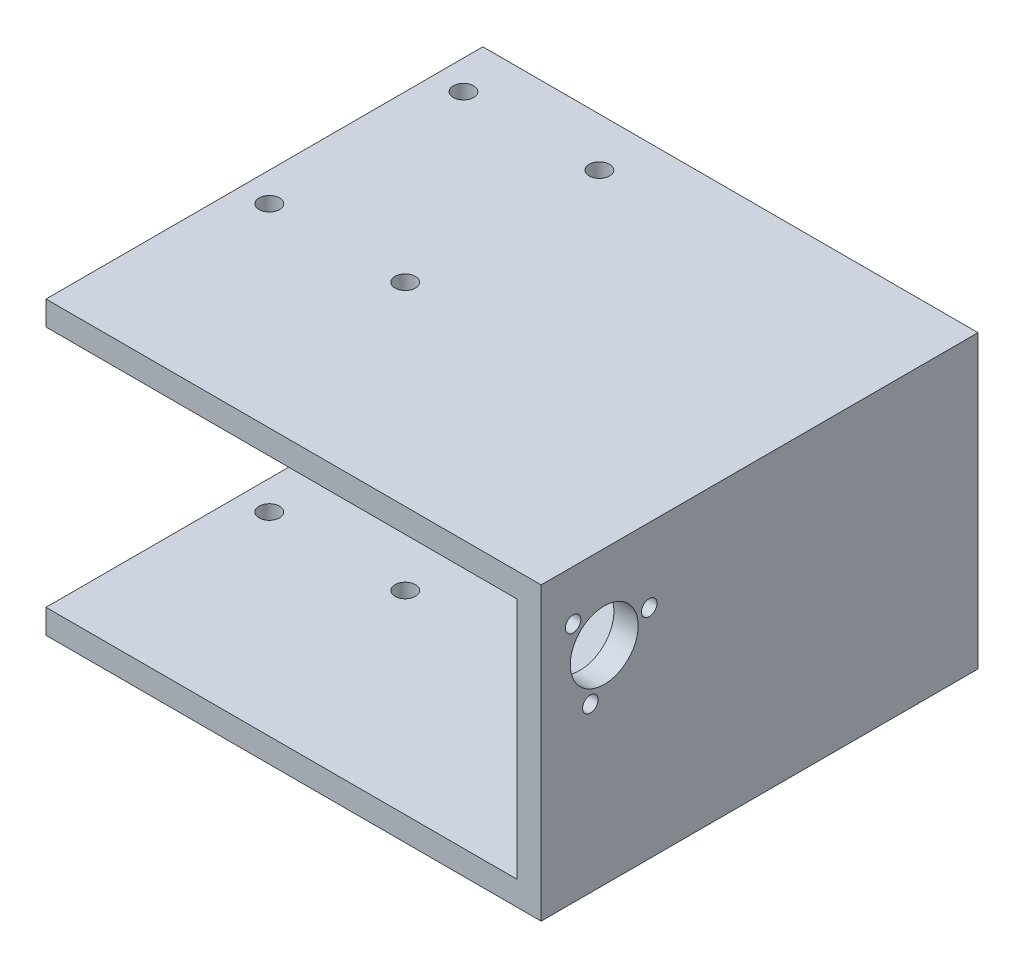
ISO-10303-21;
HEADER;
FILE_DESCRIPTION(('STEP AP214'),'2;1');
FILE_NAME('part.step','',(''),(''),'','','');
FILE_SCHEMA(('AUTOMOTIVE_DESIGN { 1 0 10303 214 1 1 1 1 }'));
ENDSEC;
DATA;
#1=APPLICATION_CONTEXT('core data for automotive mechanical design processes');
#2=APPLICATION_PROTOCOL_DEFINITION('international standard','automotive_design',2000,#1);
#3=PRODUCT_CONTEXT('',#1,'mechanical');
#4=PRODUCT('Part','Part','',(#3));
#5=PRODUCT_RELATED_PRODUCT_CATEGORY('part','',(#4));
#6=PRODUCT_DEFINITION_FORMATION('','',#4);
#7=PRODUCT_DEFINITION_CONTEXT('part definition',#1,'design');
#8=PRODUCT_DEFINITION('design','',#6,#7);
#9=PRODUCT_DEFINITION_SHAPE('','',#8);
#10=(LENGTH_UNIT() NAMED_UNIT(*) SI_UNIT(.MILLI.,.METRE.));
#11=(NAMED_UNIT(*) PLANE_ANGLE_UNIT() SI_UNIT($,.RADIAN.));
#12=(NAMED_UNIT(*) SI_UNIT($,.STERADIAN.) SOLID_ANGLE_UNIT());
#13=UNCERTAINTY_MEASURE_WITH_UNIT(LENGTH_MEASURE(1.E-05),#10,'distance_accuracy_value','');
#14=(GEOMETRIC_REPRESENTATION_CONTEXT(3) GLOBAL_UNCERTAINTY_ASSIGNED_CONTEXT((#13)) GLOBAL_UNIT_ASSIGNED_CONTEXT((#10,
#11,#12)) REPRESENTATION_CONTEXT('',''));
#15=CARTESIAN_POINT('',(0.,0.,0.));
#16=DIRECTION('',(0.,0.,1.));
#17=DIRECTION('',(1.,0.,0.));
#18=AXIS2_PLACEMENT_3D('',#15,#16,#17);
#19=CARTESIAN_POINT('',(0.,-55.,90.));
#20=DIRECTION('',(-1.,0.,0.));
#21=DIRECTION('',(0.,0.,1.));
#22=AXIS2_PLACEMENT_3D('',#19,#20,#21);
#23=PLANE('',#22);
#24=DIRECTION('',(0.,1.,0.));
#25=VECTOR('',#24,1.);
#26=CARTESIAN_POINT('',(0.,-55.,0.));
#27=LINE('',#26,#25);
#28=CARTESIAN_POINT('',(0.,-55.,0.));
#29=VERTEX_POINT('',#28);
#30=CARTESIAN_POINT('',(0.,-50.,0.));
#31=VERTEX_POINT('',#30);
#32=EDGE_CURVE('E139',#29,#31,#27,.T.);
#33=ORIENTED_EDGE('',*,*,#32,.F.);
#34=DIRECTION('',(0.,0.,-1.));
#35=VECTOR('',#34,1.);
#36=CARTESIAN_POINT('',(0.,-55.,90.));
#37=LINE('',#36,#35);
#38=CARTESIAN_POINT('',(0.,-55.,90.));
#39=VERTEX_POINT('',#38);
#40=EDGE_CURVE('E11',#39,#29,#37,.T.);
#41=ORIENTED_EDGE('',*,*,#40,.F.);
#42=DIRECTION('',(0.,1.,0.));
#43=VECTOR('',#42,1.);
#44=CARTESIAN_POINT('',(0.,-55.,90.));
#45=LINE('',#44,#43);
#46=CARTESIAN_POINT('',(0.,-50.,90.));
#47=VERTEX_POINT('',#46);
#48=EDGE_CURVE('E160',#39,#47,#45,.T.);
#49=ORIENTED_EDGE('',*,*,#48,.T.);
#50=DIRECTION('',(0.,0.,-1.));
#51=VECTOR('',#50,1.);
#52=CARTESIAN_POINT('',(0.,-50.,90.));
#53=LINE('',#52,#51);
#54=EDGE_CURVE('E97',#47,#31,#53,.T.);
#55=ORIENTED_EDGE('',*,*,#54,.T.);
#56=EDGE_LOOP('',(#33,#41,#49,#55));
#57=FACE_BOUND('',#56,.T.);
#58=ADVANCED_FACE('F41',(#57),#23,.T.);
#59=CARTESIAN_POINT('',(102.,-55.,90.));
#60=DIRECTION('',(0.,-1.,0.));
#61=DIRECTION('',(1.,0.,0.));
#62=AXIS2_PLACEMENT_3D('',#59,#60,#61);
#63=PLANE('',#62);
#64=CARTESIAN_POINT('',(6.,-55.,50.));
#65=DIRECTION('',(0.,1.,0.));
#66=DIRECTION('',(0.,0.,1.));
#67=AXIS2_PLACEMENT_3D('',#64,#65,#66);
#68=CIRCLE('',#67,2.1);
#69=CARTESIAN_POINT('',(6.,-55.,52.1));
#70=VERTEX_POINT('',#69);
#71=EDGE_CURVE('E271',#70,#70,#68,.T.);
#72=ORIENTED_EDGE('',*,*,#71,.T.);
#73=EDGE_LOOP('',(#72));
#74=FACE_BOUND('',#73,.T.);
#75=CARTESIAN_POINT('',(34.,-55.,50.));
#76=DIRECTION('',(0.,1.,0.));
#77=DIRECTION('',(0.,0.,1.));
#78=AXIS2_PLACEMENT_3D('',#75,#76,#77);
#79=CIRCLE('',#78,2.1);
#80=CARTESIAN_POINT('',(34.,-55.,52.1));
#81=VERTEX_POINT('',#80);
#82=EDGE_CURVE('E344',#81,#81,#79,.T.);
#83=ORIENTED_EDGE('',*,*,#82,.T.);
#84=EDGE_LOOP('',(#83));
#85=FACE_BOUND('',#84,.T.);
#86=CARTESIAN_POINT('',(34.,-55.,10.));
#87=DIRECTION('',(0.,1.,0.));
#88=DIRECTION('',(0.,0.,1.));
#89=AXIS2_PLACEMENT_3D('',#86,#87,#88);
#90=CIRCLE('',#89,2.1);
#91=CARTESIAN_POINT('',(34.,-55.,12.1));
#92=VERTEX_POINT('',#91);
#93=EDGE_CURVE('E263',#92,#92,#90,.T.);
#94=ORIENTED_EDGE('',*,*,#93,.T.);
#95=EDGE_LOOP('',(#94));
#96=FACE_BOUND('',#95,.T.);
#97=CARTESIAN_POINT('',(6.,-55.,10.));
#98=DIRECTION('',(0.,1.,0.));
#99=DIRECTION('',(0.,0.,1.));
#100=AXIS2_PLACEMENT_3D('',#97,#98,#99);
#101=CIRCLE('',#100,2.1);
#102=CARTESIAN_POINT('',(6.,-55.,12.1));
#103=VERTEX_POINT('',#102);
#104=EDGE_CURVE('E261',#103,#103,#101,.T.);
#105=ORIENTED_EDGE('',*,*,#104,.T.);
#106=EDGE_LOOP('',(#105));
#107=FACE_BOUND('',#106,.T.);
#108=DIRECTION('',(-1.,0.,0.));
#109=VECTOR('',#108,1.);
#110=CARTESIAN_POINT('',(102.,-55.,0.));
#111=LINE('',#110,#109);
#112=CARTESIAN_POINT('',(102.,-55.,0.));
#113=VERTEX_POINT('',#112);
#114=EDGE_CURVE('E158',#113,#29,#111,.T.);
#115=ORIENTED_EDGE('',*,*,#114,.F.);
#116=DIRECTION('',(0.,0.,-1.));
#117=VECTOR('',#116,1.);
#118=CARTESIAN_POINT('',(102.,-55.,90.));
#119=LINE('',#118,#117);
#120=CARTESIAN_POINT('',(102.,-55.,90.));
#121=VERTEX_POINT('',#120);
#122=EDGE_CURVE('E50',#121,#113,#119,.T.);
#123=ORIENTED_EDGE('',*,*,#122,.F.);
#124=DIRECTION('',(-1.,0.,0.));
#125=VECTOR('',#124,1.);
#126=CARTESIAN_POINT('',(102.,-55.,90.));
#127=LINE('',#126,#125);
#128=EDGE_CURVE('E129',#121,#39,#127,.T.);
#129=ORIENTED_EDGE('',*,*,#128,.T.);
#130=ORIENTED_EDGE('',*,*,#40,.T.);
#131=EDGE_LOOP('',(#115,#123,#129,#130));
#132=FACE_BOUND('',#131,.T.);
#133=ADVANCED_FACE('F214',(#74,#85,#96,#107,#132),#63,.T.);
#134=CARTESIAN_POINT('',(102.,5.,90.));
#135=DIRECTION('',(1.,0.,0.));
#136=DIRECTION('',(0.,1.,0.));
#137=AXIS2_PLACEMENT_3D('',#134,#135,#136);
#138=PLANE('',#137);
#139=CARTESIAN_POINT('',(102.,-21.3117545365653,79.8521228443574));
#140=DIRECTION('',(1.,0.,0.));
#141=DIRECTION('',(0.,0.866025403784436,0.500000000000004));
#142=AXIS2_PLACEMENT_3D('',#139,#140,#141);
#143=CIRCLE('',#142,1.60000000000001);
#144=CARTESIAN_POINT('',(102.,-19.9261138905102,80.6521228443574));
#145=VERTEX_POINT('',#144);
#146=EDGE_CURVE('E323',#145,#145,#143,.T.);
#147=ORIENTED_EDGE('',*,*,#146,.F.);
#148=EDGE_LOOP('',(#147));
#149=FACE_BOUND('',#148,.T.);
#150=CARTESIAN_POINT('',(102.,-10.1891335696448,67.7262289462969));
#151=DIRECTION('',(1.,0.,0.));
#152=DIRECTION('',(0.,-0.866025403784443,0.499999999999992));
#153=AXIS2_PLACEMENT_3D('',#150,#151,#152);
#154=CIRCLE('',#153,1.60000000000001);
#155=CARTESIAN_POINT('',(102.,-11.5747742156999,68.5262289462969));
#156=VERTEX_POINT('',#155);
#157=EDGE_CURVE('E328',#156,#156,#154,.T.);
#158=ORIENTED_EDGE('',*,*,#157,.F.);
#159=EDGE_LOOP('',(#158));
#160=FACE_BOUND('',#159,.T.);
#161=CARTESIAN_POINT('',(102.,-5.24911189378993,83.4216482093457));
#162=DIRECTION('',(1.,0.,0.));
#163=DIRECTION('',(0.,0.,-1.));
#164=AXIS2_PLACEMENT_3D('',#161,#162,#163);
#165=CIRCLE('',#164,1.60000000000001);
#166=CARTESIAN_POINT('',(102.,-5.24911189378993,81.8216482093457));
#167=VERTEX_POINT('',#166);
#168=EDGE_CURVE('E324',#167,#167,#165,.T.);
#169=ORIENTED_EDGE('',*,*,#168,.F.);
#170=EDGE_LOOP('',(#169));
#171=FACE_BOUND('',#170,.T.);
#172=CARTESIAN_POINT('',(102.,-12.25,77.));
#173=DIRECTION('',(1.,0.,0.));
#174=DIRECTION('',(0.,1.,0.));
#175=AXIS2_PLACEMENT_3D('',#172,#173,#174);
#176=CIRCLE('',#175,7.);
#177=CARTESIAN_POINT('',(102.,-5.25,77.));
#178=VERTEX_POINT('',#177);
#179=EDGE_CURVE('E339',#178,#178,#176,.T.);
#180=ORIENTED_EDGE('',*,*,#179,.F.);
#181=EDGE_LOOP('',(#180));
#182=FACE_BOUND('',#181,.T.);
#183=DIRECTION('',(0.,-1.,0.));
#184=VECTOR('',#183,1.);
#185=CARTESIAN_POINT('',(102.,5.,0.));
#186=LINE('',#185,#184);
#187=CARTESIAN_POINT('',(102.,5.,0.));
#188=VERTEX_POINT('',#187);
#189=EDGE_CURVE('E116',#188,#113,#186,.T.);
#190=ORIENTED_EDGE('',*,*,#189,.F.);
#191=DIRECTION('',(0.,0.,-1.));
#192=VECTOR('',#191,1.);
#193=CARTESIAN_POINT('',(102.,5.,90.));
#194=LINE('',#193,#192);
#195=CARTESIAN_POINT('',(102.,5.,90.));
#196=VERTEX_POINT('',#195);
#197=EDGE_CURVE('E111',#196,#188,#194,.T.);
#198=ORIENTED_EDGE('',*,*,#197,.F.);
#199=DIRECTION('',(0.,-1.,0.));
#200=VECTOR('',#199,1.);
#201=CARTESIAN_POINT('',(102.,5.,90.));
#202=LINE('',#201,#200);
#203=EDGE_CURVE('E114',#196,#121,#202,.T.);
#204=ORIENTED_EDGE('',*,*,#203,.T.);
#205=ORIENTED_EDGE('',*,*,#122,.T.);
#206=EDGE_LOOP('',(#190,#198,#204,#205));
#207=FACE_BOUND('',#206,.T.);
#208=ADVANCED_FACE('F113',(#149,#160,#171,#182,#207),#138,.T.);
#209=CARTESIAN_POINT('',(0.,5.,90.));
#210=DIRECTION('',(0.,1.,0.));
#211=DIRECTION('',(0.,0.,1.));
#212=AXIS2_PLACEMENT_3D('',#209,#210,#211);
#213=PLANE('',#212);
#214=CARTESIAN_POINT('',(6.,5.,50.));
#215=DIRECTION('',(0.,1.,0.));
#216=DIRECTION('',(0.,0.,1.));
#217=AXIS2_PLACEMENT_3D('',#214,#215,#216);
#218=CIRCLE('',#217,2.1);
#219=CARTESIAN_POINT('',(6.,5.,52.1));
#220=VERTEX_POINT('',#219);
#221=EDGE_CURVE('E342',#220,#220,#218,.T.);
#222=ORIENTED_EDGE('',*,*,#221,.F.);
#223=EDGE_LOOP('',(#222));
#224=FACE_BOUND('',#223,.T.);
#225=CARTESIAN_POINT('',(34.,5.,50.));
#226=DIRECTION('',(0.,1.,0.));
#227=DIRECTION('',(0.,0.,1.));
#228=AXIS2_PLACEMENT_3D('',#225,#226,#227);
#229=CIRCLE('',#228,2.1);
#230=CARTESIAN_POINT('',(34.,5.,52.1));
#231=VERTEX_POINT('',#230);
#232=EDGE_CURVE('E346',#231,#231,#229,.T.);
#233=ORIENTED_EDGE('',*,*,#232,.F.);
#234=EDGE_LOOP('',(#233));
#235=FACE_BOUND('',#234,.T.);
#236=CARTESIAN_POINT('',(34.,5.,10.));
#237=DIRECTION('',(0.,1.,0.));
#238=DIRECTION('',(0.,0.,1.));
#239=AXIS2_PLACEMENT_3D('',#236,#237,#238);
#240=CIRCLE('',#239,2.1);
#241=CARTESIAN_POINT('',(34.,5.,12.1));
#242=VERTEX_POINT('',#241);
#243=EDGE_CURVE('E268',#242,#242,#240,.T.);
#244=ORIENTED_EDGE('',*,*,#243,.F.);
#245=EDGE_LOOP('',(#244));
#246=FACE_BOUND('',#245,.T.);
#247=CARTESIAN_POINT('',(6.,5.,10.));
#248=DIRECTION('',(0.,1.,0.));
#249=DIRECTION('',(0.,0.,1.));
#250=AXIS2_PLACEMENT_3D('',#247,#248,#249);
#251=CIRCLE('',#250,2.1);
#252=CARTESIAN_POINT('',(6.,5.,12.1));
#253=VERTEX_POINT('',#252);
#254=EDGE_CURVE('E175',#253,#253,#251,.T.);
#255=ORIENTED_EDGE('',*,*,#254,.F.);
#256=EDGE_LOOP('',(#255));
#257=FACE_BOUND('',#256,.T.);
#258=DIRECTION('',(1.,0.,0.));
#259=VECTOR('',#258,1.);
#260=CARTESIAN_POINT('',(0.,5.,0.));
#261=LINE('',#260,#259);
#262=CARTESIAN_POINT('',(0.,5.,0.));
#263=VERTEX_POINT('',#262);
#264=EDGE_CURVE('E155',#263,#188,#261,.T.);
#265=ORIENTED_EDGE('',*,*,#264,.F.);
#266=DIRECTION('',(0.,0.,-1.));
#267=VECTOR('',#266,1.);
#268=CARTESIAN_POINT('',(0.,5.,90.));
#269=LINE('',#268,#267);
#270=CARTESIAN_POINT('',(0.,5.,90.));
#271=VERTEX_POINT('',#270);
#272=EDGE_CURVE('E121',#271,#263,#269,.T.);
#273=ORIENTED_EDGE('',*,*,#272,.F.);
#274=DIRECTION('',(1.,0.,0.));
#275=VECTOR('',#274,1.);
#276=CARTESIAN_POINT('',(0.,5.,90.));
#277=LINE('',#276,#275);
#278=EDGE_CURVE('E127',#271,#196,#277,.T.);
#279=ORIENTED_EDGE('',*,*,#278,.T.);
#280=ORIENTED_EDGE('',*,*,#197,.T.);
#281=EDGE_LOOP('',(#265,#273,#279,#280));
#282=FACE_BOUND('',#281,.T.);
#283=ADVANCED_FACE('F131',(#224,#235,#246,#257,#282),#213,.T.);
#284=CARTESIAN_POINT('',(0.,0.,90.));
#285=DIRECTION('',(-1.,0.,0.));
#286=DIRECTION('',(0.,0.,1.));
#287=AXIS2_PLACEMENT_3D('',#284,#285,#286);
#288=PLANE('',#287);
#289=DIRECTION('',(0.,1.,0.));
#290=VECTOR('',#289,1.);
#291=CARTESIAN_POINT('',(0.,0.,0.));
#292=LINE('',#291,#290);
#293=CARTESIAN_POINT('',(0.,0.,0.));
#294=VERTEX_POINT('',#293);
#295=EDGE_CURVE('E152',#294,#263,#292,.T.);
#296=ORIENTED_EDGE('',*,*,#295,.F.);
#297=DIRECTION('',(0.,0.,-1.));
#298=VECTOR('',#297,1.);
#299=CARTESIAN_POINT('',(0.,0.,90.));
#300=LINE('',#299,#298);
#301=CARTESIAN_POINT('',(0.,0.,90.));
#302=VERTEX_POINT('',#301);
#303=EDGE_CURVE('E164',#302,#294,#300,.T.);
#304=ORIENTED_EDGE('',*,*,#303,.F.);
#305=DIRECTION('',(0.,1.,0.));
#306=VECTOR('',#305,1.);
#307=CARTESIAN_POINT('',(0.,0.,90.));
#308=LINE('',#307,#306);
#309=EDGE_CURVE('E132',#302,#271,#308,.T.);
#310=ORIENTED_EDGE('',*,*,#309,.T.);
#311=ORIENTED_EDGE('',*,*,#272,.T.);
#312=EDGE_LOOP('',(#296,#304,#310,#311));
#313=FACE_BOUND('',#312,.T.);
#314=ADVANCED_FACE('F232',(#313),#288,.T.);
#315=CARTESIAN_POINT('',(97.,0.,90.));
#316=DIRECTION('',(0.,-1.,0.));
#317=DIRECTION('',(1.,0.,0.));
#318=AXIS2_PLACEMENT_3D('',#315,#316,#317);
#319=PLANE('',#318);
#320=CARTESIAN_POINT('',(6.,0.,50.));
#321=DIRECTION('',(0.,-1.,0.));
#322=DIRECTION('',(1.,0.,0.));
#323=AXIS2_PLACEMENT_3D('',#320,#321,#322);
#324=CIRCLE('',#323,2.1);
#325=CARTESIAN_POINT('',(8.1,0.,50.));
#326=VERTEX_POINT('',#325);
#327=EDGE_CURVE('E143',#326,#326,#324,.F.);
#328=ORIENTED_EDGE('',*,*,#327,.T.);
#329=EDGE_LOOP('',(#328));
#330=FACE_BOUND('',#329,.T.);
#331=CARTESIAN_POINT('',(34.,0.,50.));
#332=DIRECTION('',(0.,-1.,0.));
#333=DIRECTION('',(1.,0.,0.));
#334=AXIS2_PLACEMENT_3D('',#331,#332,#333);
#335=CIRCLE('',#334,2.1);
#336=CARTESIAN_POINT('',(36.1,0.,50.));
#337=VERTEX_POINT('',#336);
#338=EDGE_CURVE('E182',#337,#337,#335,.F.);
#339=ORIENTED_EDGE('',*,*,#338,.T.);
#340=EDGE_LOOP('',(#339));
#341=FACE_BOUND('',#340,.T.);
#342=CARTESIAN_POINT('',(34.,0.,10.));
#343=DIRECTION('',(0.,-1.,0.));
#344=DIRECTION('',(1.,0.,0.));
#345=AXIS2_PLACEMENT_3D('',#342,#343,#344);
#346=CIRCLE('',#345,2.1);
#347=CARTESIAN_POINT('',(36.1,0.,10.));
#348=VERTEX_POINT('',#347);
#349=EDGE_CURVE('E179',#348,#348,#346,.F.);
#350=ORIENTED_EDGE('',*,*,#349,.T.);
#351=EDGE_LOOP('',(#350));
#352=FACE_BOUND('',#351,.T.);
#353=CARTESIAN_POINT('',(6.,0.,10.));
#354=DIRECTION('',(0.,-1.,0.));
#355=DIRECTION('',(1.,0.,0.));
#356=AXIS2_PLACEMENT_3D('',#353,#354,#355);
#357=CIRCLE('',#356,2.1);
#358=CARTESIAN_POINT('',(8.1,0.,10.));
#359=VERTEX_POINT('',#358);
#360=EDGE_CURVE('E174',#359,#359,#357,.F.);
#361=ORIENTED_EDGE('',*,*,#360,.T.);
#362=EDGE_LOOP('',(#361));
#363=FACE_BOUND('',#362,.T.);
#364=DIRECTION('',(-1.,0.,0.));
#365=VECTOR('',#364,1.);
#366=CARTESIAN_POINT('',(97.,0.,0.));
#367=LINE('',#366,#365);
#368=CARTESIAN_POINT('',(97.,0.,0.));
#369=VERTEX_POINT('',#368);
#370=EDGE_CURVE('E149',#369,#294,#367,.T.);
#371=ORIENTED_EDGE('',*,*,#370,.F.);
#372=DIRECTION('',(0.,0.,-1.));
#373=VECTOR('',#372,1.);
#374=CARTESIAN_POINT('',(97.,0.,90.));
#375=LINE('',#374,#373);
#376=CARTESIAN_POINT('',(97.,0.,90.));
#377=VERTEX_POINT('',#376);
#378=EDGE_CURVE('E166',#377,#369,#375,.T.);
#379=ORIENTED_EDGE('',*,*,#378,.F.);
#380=DIRECTION('',(-1.,0.,0.));
#381=VECTOR('',#380,1.);
#382=CARTESIAN_POINT('',(97.,0.,90.));
#383=LINE('',#382,#381);
#384=EDGE_CURVE('E134',#377,#302,#383,.T.);
#385=ORIENTED_EDGE('',*,*,#384,.T.);
#386=ORIENTED_EDGE('',*,*,#303,.T.);
#387=EDGE_LOOP('',(#371,#379,#385,#386));
#388=FACE_BOUND('',#387,.T.);
#389=ADVANCED_FACE('F205',(#330,#341,#352,#363,#388),#319,.T.);
#390=CARTESIAN_POINT('',(97.,-50.,90.));
#391=DIRECTION('',(-1.,0.,0.));
#392=DIRECTION('',(0.,0.,1.));
#393=AXIS2_PLACEMENT_3D('',#390,#391,#392);
#394=PLANE('',#393);
#395=CARTESIAN_POINT('',(97.,-21.3117545365653,79.8521228443574));
#396=DIRECTION('',(-1.,0.,0.));
#397=DIRECTION('',(0.,-0.866025403784436,-0.500000000000004));
#398=AXIS2_PLACEMENT_3D('',#395,#396,#397);
#399=CIRCLE('',#398,1.60000000000001);
#400=CARTESIAN_POINT('',(97.,-22.6973951826204,79.0521228443574));
#401=VERTEX_POINT('',#400);
#402=EDGE_CURVE('E320',#401,#401,#399,.T.);
#403=ORIENTED_EDGE('',*,*,#402,.F.);
#404=EDGE_LOOP('',(#403));
#405=FACE_BOUND('',#404,.T.);
#406=CARTESIAN_POINT('',(97.,-10.1891335696448,67.7262289462969));
#407=DIRECTION('',(-1.,0.,0.));
#408=DIRECTION('',(0.,0.866025403784443,-0.499999999999992));
#409=AXIS2_PLACEMENT_3D('',#406,#407,#408);
#410=CIRCLE('',#409,1.60000000000001);
#411=CARTESIAN_POINT('',(97.,-8.80349292358964,66.9262289462969));
#412=VERTEX_POINT('',#411);
#413=EDGE_CURVE('E331',#412,#412,#410,.T.);
#414=ORIENTED_EDGE('',*,*,#413,.F.);
#415=EDGE_LOOP('',(#414));
#416=FACE_BOUND('',#415,.T.);
#417=CARTESIAN_POINT('',(97.,-5.24911189378993,83.4216482093457));
#418=DIRECTION('',(-1.,0.,0.));
#419=DIRECTION('',(0.,0.,1.));
#420=AXIS2_PLACEMENT_3D('',#417,#418,#419);
#421=CIRCLE('',#420,1.60000000000001);
#422=CARTESIAN_POINT('',(97.,-5.24911189378993,85.0216482093457));
#423=VERTEX_POINT('',#422);
#424=EDGE_CURVE('E44',#423,#423,#421,.T.);
#425=ORIENTED_EDGE('',*,*,#424,.F.);
#426=EDGE_LOOP('',(#425));
#427=FACE_BOUND('',#426,.T.);
#428=CARTESIAN_POINT('',(97.,-12.25,77.));
#429=DIRECTION('',(-1.,0.,0.));
#430=DIRECTION('',(0.,0.,1.));
#431=AXIS2_PLACEMENT_3D('',#428,#429,#430);
#432=CIRCLE('',#431,7.);
#433=CARTESIAN_POINT('',(97.,-12.25,84.));
#434=VERTEX_POINT('',#433);
#435=EDGE_CURVE('E336',#434,#434,#432,.T.);
#436=ORIENTED_EDGE('',*,*,#435,.F.);
#437=EDGE_LOOP('',(#436));
#438=FACE_BOUND('',#437,.T.);
#439=DIRECTION('',(0.,1.,0.));
#440=VECTOR('',#439,1.);
#441=CARTESIAN_POINT('',(97.,-50.,0.));
#442=LINE('',#441,#440);
#443=CARTESIAN_POINT('',(97.,-50.,0.));
#444=VERTEX_POINT('',#443);
#445=EDGE_CURVE('E146',#444,#369,#442,.T.);
#446=ORIENTED_EDGE('',*,*,#445,.F.);
#447=DIRECTION('',(0.,0.,-1.));
#448=VECTOR('',#447,1.);
#449=CARTESIAN_POINT('',(97.,-50.,90.));
#450=LINE('',#449,#448);
#451=CARTESIAN_POINT('',(97.,-50.,90.));
#452=VERTEX_POINT('',#451);
#453=EDGE_CURVE('E168',#452,#444,#450,.T.);
#454=ORIENTED_EDGE('',*,*,#453,.F.);
#455=DIRECTION('',(0.,1.,0.));
#456=VECTOR('',#455,1.);
#457=CARTESIAN_POINT('',(97.,-50.,90.));
#458=LINE('',#457,#456);
#459=EDGE_CURVE('E199',#452,#377,#458,.T.);
#460=ORIENTED_EDGE('',*,*,#459,.T.);
#461=ORIENTED_EDGE('',*,*,#378,.T.);
#462=EDGE_LOOP('',(#446,#454,#460,#461));
#463=FACE_BOUND('',#462,.T.);
#464=ADVANCED_FACE('F210',(#405,#416,#427,#438,#463),#394,.T.);
#465=CARTESIAN_POINT('',(0.,-50.,90.));
#466=DIRECTION('',(0.,1.,0.));
#467=DIRECTION('',(0.,0.,1.));
#468=AXIS2_PLACEMENT_3D('',#465,#466,#467);
#469=PLANE('',#468);
#470=CARTESIAN_POINT('',(6.,-50.,50.));
#471=DIRECTION('',(0.,1.,0.));
#472=DIRECTION('',(0.,0.,1.));
#473=AXIS2_PLACEMENT_3D('',#470,#471,#472);
#474=CIRCLE('',#473,2.1);
#475=CARTESIAN_POINT('',(6.,-50.,52.1));
#476=VERTEX_POINT('',#475);
#477=EDGE_CURVE('E183',#476,#476,#474,.F.);
#478=ORIENTED_EDGE('',*,*,#477,.T.);
#479=EDGE_LOOP('',(#478));
#480=FACE_BOUND('',#479,.T.);
#481=CARTESIAN_POINT('',(34.,-50.,50.));
#482=DIRECTION('',(0.,1.,0.));
#483=DIRECTION('',(0.,0.,1.));
#484=AXIS2_PLACEMENT_3D('',#481,#482,#483);
#485=CIRCLE('',#484,2.1);
#486=CARTESIAN_POINT('',(34.,-50.,52.1));
#487=VERTEX_POINT('',#486);
#488=EDGE_CURVE('E180',#487,#487,#485,.F.);
#489=ORIENTED_EDGE('',*,*,#488,.T.);
#490=EDGE_LOOP('',(#489));
#491=FACE_BOUND('',#490,.T.);
#492=CARTESIAN_POINT('',(34.,-50.,10.));
#493=DIRECTION('',(0.,1.,0.));
#494=DIRECTION('',(0.,0.,1.));
#495=AXIS2_PLACEMENT_3D('',#492,#493,#494);
#496=CIRCLE('',#495,2.1);
#497=CARTESIAN_POINT('',(34.,-50.,12.1));
#498=VERTEX_POINT('',#497);
#499=EDGE_CURVE('E176',#498,#498,#496,.F.);
#500=ORIENTED_EDGE('',*,*,#499,.T.);
#501=EDGE_LOOP('',(#500));
#502=FACE_BOUND('',#501,.T.);
#503=CARTESIAN_POINT('',(6.,-50.,10.));
#504=DIRECTION('',(0.,1.,0.));
#505=DIRECTION('',(0.,0.,1.));
#506=AXIS2_PLACEMENT_3D('',#503,#504,#505);
#507=CIRCLE('',#506,2.1);
#508=CARTESIAN_POINT('',(6.,-50.,12.1));
#509=VERTEX_POINT('',#508);
#510=EDGE_CURVE('E171',#509,#509,#507,.F.);
#511=ORIENTED_EDGE('',*,*,#510,.T.);
#512=EDGE_LOOP('',(#511));
#513=FACE_BOUND('',#512,.T.);
#514=DIRECTION('',(1.,0.,0.));
#515=VECTOR('',#514,1.);
#516=CARTESIAN_POINT('',(0.,-50.,0.));
#517=LINE('',#516,#515);
#518=EDGE_CURVE('E142',#31,#444,#517,.T.);
#519=ORIENTED_EDGE('',*,*,#518,.F.);
#520=ORIENTED_EDGE('',*,*,#54,.F.);
#521=DIRECTION('',(1.,0.,0.));
#522=VECTOR('',#521,1.);
#523=CARTESIAN_POINT('',(0.,-50.,90.));
#524=LINE('',#523,#522);
#525=EDGE_CURVE('E197',#47,#452,#524,.T.);
#526=ORIENTED_EDGE('',*,*,#525,.T.);
#527=ORIENTED_EDGE('',*,*,#453,.T.);
#528=EDGE_LOOP('',(#519,#520,#526,#527));
#529=FACE_BOUND('',#528,.T.);
#530=ADVANCED_FACE('F211',(#480,#491,#502,#513,#529),#469,.T.);
#531=CARTESIAN_POINT('',(0.,0.,90.));
#532=DIRECTION('',(0.,0.,-1.));
#533=DIRECTION('',(-1.,0.,0.));
#534=AXIS2_PLACEMENT_3D('',#531,#532,#533);
#535=PLANE('',#534);
#536=ORIENTED_EDGE('',*,*,#48,.F.);
#537=ORIENTED_EDGE('',*,*,#128,.F.);
#538=ORIENTED_EDGE('',*,*,#203,.F.);
#539=ORIENTED_EDGE('',*,*,#278,.F.);
#540=ORIENTED_EDGE('',*,*,#309,.F.);
#541=ORIENTED_EDGE('',*,*,#384,.F.);
#542=ORIENTED_EDGE('',*,*,#459,.F.);
#543=ORIENTED_EDGE('',*,*,#525,.F.);
#544=EDGE_LOOP('',(#536,#537,#538,#539,#540,#541,#542,#543));
#545=FACE_BOUND('',#544,.T.);
#546=ADVANCED_FACE('F125',(#545),#535,.F.);
#547=CARTESIAN_POINT('',(0.,0.,0.));
#548=DIRECTION('',(0.,0.,-1.));
#549=DIRECTION('',(-1.,0.,0.));
#550=AXIS2_PLACEMENT_3D('',#547,#548,#549);
#551=PLANE('',#550);
#552=ORIENTED_EDGE('',*,*,#32,.T.);
#553=ORIENTED_EDGE('',*,*,#518,.T.);
#554=ORIENTED_EDGE('',*,*,#445,.T.);
#555=ORIENTED_EDGE('',*,*,#370,.T.);
#556=ORIENTED_EDGE('',*,*,#295,.T.);
#557=ORIENTED_EDGE('',*,*,#264,.T.);
#558=ORIENTED_EDGE('',*,*,#189,.T.);
#559=ORIENTED_EDGE('',*,*,#114,.T.);
#560=EDGE_LOOP('',(#552,#553,#554,#555,#556,#557,#558,#559));
#561=FACE_BOUND('',#560,.T.);
#562=ADVANCED_FACE('F213',(#561),#551,.T.);
#563=CARTESIAN_POINT('',(6.,5.,10.));
#564=DIRECTION('',(0.,-1.,0.));
#565=DIRECTION('',(0.,0.,-1.));
#566=AXIS2_PLACEMENT_3D('',#563,#564,#565);
#567=CYLINDRICAL_SURFACE('',#566,2.1);
#568=ORIENTED_EDGE('',*,*,#510,.F.);
#569=EDGE_LOOP('',(#568));
#570=FACE_BOUND('',#569,.T.);
#571=ORIENTED_EDGE('',*,*,#104,.F.);
#572=EDGE_LOOP('',(#571));
#573=FACE_BOUND('',#572,.T.);
#574=ADVANCED_FACE('F254',(#570,#573),#567,.F.);
#575=CARTESIAN_POINT('',(34.,5.,10.));
#576=DIRECTION('',(0.,-1.,0.));
#577=DIRECTION('',(0.,0.,-1.));
#578=AXIS2_PLACEMENT_3D('',#575,#576,#577);
#579=CYLINDRICAL_SURFACE('',#578,2.1);
#580=ORIENTED_EDGE('',*,*,#499,.F.);
#581=EDGE_LOOP('',(#580));
#582=FACE_BOUND('',#581,.T.);
#583=ORIENTED_EDGE('',*,*,#93,.F.);
#584=EDGE_LOOP('',(#583));
#585=FACE_BOUND('',#584,.T.);
#586=ADVANCED_FACE('F256',(#582,#585),#579,.F.);
#587=CARTESIAN_POINT('',(34.,5.,50.));
#588=DIRECTION('',(0.,-1.,0.));
#589=DIRECTION('',(0.,0.,-1.));
#590=AXIS2_PLACEMENT_3D('',#587,#588,#589);
#591=CYLINDRICAL_SURFACE('',#590,2.1);
#592=ORIENTED_EDGE('',*,*,#488,.F.);
#593=EDGE_LOOP('',(#592));
#594=FACE_BOUND('',#593,.T.);
#595=ORIENTED_EDGE('',*,*,#82,.F.);
#596=EDGE_LOOP('',(#595));
#597=FACE_BOUND('',#596,.T.);
#598=ADVANCED_FACE('F290',(#594,#597),#591,.F.);
#599=CARTESIAN_POINT('',(6.,5.,50.));
#600=DIRECTION('',(0.,-1.,0.));
#601=DIRECTION('',(0.,0.,-1.));
#602=AXIS2_PLACEMENT_3D('',#599,#600,#601);
#603=CYLINDRICAL_SURFACE('',#602,2.1);
#604=ORIENTED_EDGE('',*,*,#477,.F.);
#605=EDGE_LOOP('',(#604));
#606=FACE_BOUND('',#605,.T.);
#607=ORIENTED_EDGE('',*,*,#71,.F.);
#608=EDGE_LOOP('',(#607));
#609=FACE_BOUND('',#608,.T.);
#610=ADVANCED_FACE('F280',(#606,#609),#603,.F.);
#611=ORIENTED_EDGE('',*,*,#360,.F.);
#612=EDGE_LOOP('',(#611));
#613=FACE_BOUND('',#612,.T.);
#614=ORIENTED_EDGE('',*,*,#254,.T.);
#615=EDGE_LOOP('',(#614));
#616=FACE_BOUND('',#615,.T.);
#617=ADVANCED_FACE('F258',(#613,#616),#567,.F.);
#618=ORIENTED_EDGE('',*,*,#349,.F.);
#619=EDGE_LOOP('',(#618));
#620=FACE_BOUND('',#619,.T.);
#621=ORIENTED_EDGE('',*,*,#243,.T.);
#622=EDGE_LOOP('',(#621));
#623=FACE_BOUND('',#622,.T.);
#624=ADVANCED_FACE('F279',(#620,#623),#579,.F.);
#625=ORIENTED_EDGE('',*,*,#338,.F.);
#626=EDGE_LOOP('',(#625));
#627=FACE_BOUND('',#626,.T.);
#628=ORIENTED_EDGE('',*,*,#232,.T.);
#629=EDGE_LOOP('',(#628));
#630=FACE_BOUND('',#629,.T.);
#631=ADVANCED_FACE('F287',(#627,#630),#591,.F.);
#632=ORIENTED_EDGE('',*,*,#327,.F.);
#633=EDGE_LOOP('',(#632));
#634=FACE_BOUND('',#633,.T.);
#635=ORIENTED_EDGE('',*,*,#221,.T.);
#636=EDGE_LOOP('',(#635));
#637=FACE_BOUND('',#636,.T.);
#638=ADVANCED_FACE('F293',(#634,#637),#603,.F.);
#639=CARTESIAN_POINT('',(107.,-12.25,77.));
#640=DIRECTION('',(-1.,0.,0.));
#641=DIRECTION('',(0.,0.,1.));
#642=AXIS2_PLACEMENT_3D('',#639,#640,#641);
#643=CYLINDRICAL_SURFACE('',#642,7.);
#644=ORIENTED_EDGE('',*,*,#179,.T.);
#645=EDGE_LOOP('',(#644));
#646=FACE_BOUND('',#645,.T.);
#647=ORIENTED_EDGE('',*,*,#435,.T.);
#648=EDGE_LOOP('',(#647));
#649=FACE_BOUND('',#648,.T.);
#650=ADVANCED_FACE('F300',(#646,#649),#643,.F.);
#651=CARTESIAN_POINT('',(92.,-5.24911189378993,83.4216482093457));
#652=DIRECTION('',(1.,0.,0.));
#653=DIRECTION('',(0.,0.,-1.));
#654=AXIS2_PLACEMENT_3D('',#651,#652,#653);
#655=CYLINDRICAL_SURFACE('',#654,1.60000000000001);
#656=ORIENTED_EDGE('',*,*,#424,.T.);
#657=EDGE_LOOP('',(#656));
#658=FACE_BOUND('',#657,.T.);
#659=ORIENTED_EDGE('',*,*,#168,.T.);
#660=EDGE_LOOP('',(#659));
#661=FACE_BOUND('',#660,.T.);
#662=ADVANCED_FACE('F303',(#658,#661),#655,.F.);
#663=CARTESIAN_POINT('',(92.,-10.1891335696448,67.7262289462969));
#664=DIRECTION('',(1.,0.,0.));
#665=DIRECTION('',(0.,-0.866025403784443,0.499999999999992));
#666=AXIS2_PLACEMENT_3D('',#663,#664,#665);
#667=CYLINDRICAL_SURFACE('',#666,1.60000000000001);
#668=ORIENTED_EDGE('',*,*,#413,.T.);
#669=EDGE_LOOP('',(#668));
#670=FACE_BOUND('',#669,.T.);
#671=ORIENTED_EDGE('',*,*,#157,.T.);
#672=EDGE_LOOP('',(#671));
#673=FACE_BOUND('',#672,.T.);
#674=ADVANCED_FACE('F307',(#670,#673),#667,.F.);
#675=CARTESIAN_POINT('',(92.,-21.3117545365653,79.8521228443574));
#676=DIRECTION('',(1.,0.,0.));
#677=DIRECTION('',(0.,0.866025403784436,0.500000000000004));
#678=AXIS2_PLACEMENT_3D('',#675,#676,#677);
#679=CYLINDRICAL_SURFACE('',#678,1.60000000000001);
#680=ORIENTED_EDGE('',*,*,#402,.T.);
#681=EDGE_LOOP('',(#680));
#682=FACE_BOUND('',#681,.T.);
#683=ORIENTED_EDGE('',*,*,#146,.T.);
#684=EDGE_LOOP('',(#683));
#685=FACE_BOUND('',#684,.T.);
#686=ADVANCED_FACE('F311',(#682,#685),#679,.F.);
#687=CLOSED_SHELL('',(#58,#133,#208,#283,#314,#389,#464,#530,#546,#562,#574,#586,#598,#610,#617,
#624,#631,#638,#650,#662,#674,#686));
#688=MANIFOLD_SOLID_BREP('B2',#687);
#689=ADVANCED_BREP_SHAPE_REPRESENTATION('',(#18,#688),#14);
#690=SHAPE_DEFINITION_REPRESENTATION(#9,#689);
ENDSEC;
END-ISO-10303-21;
